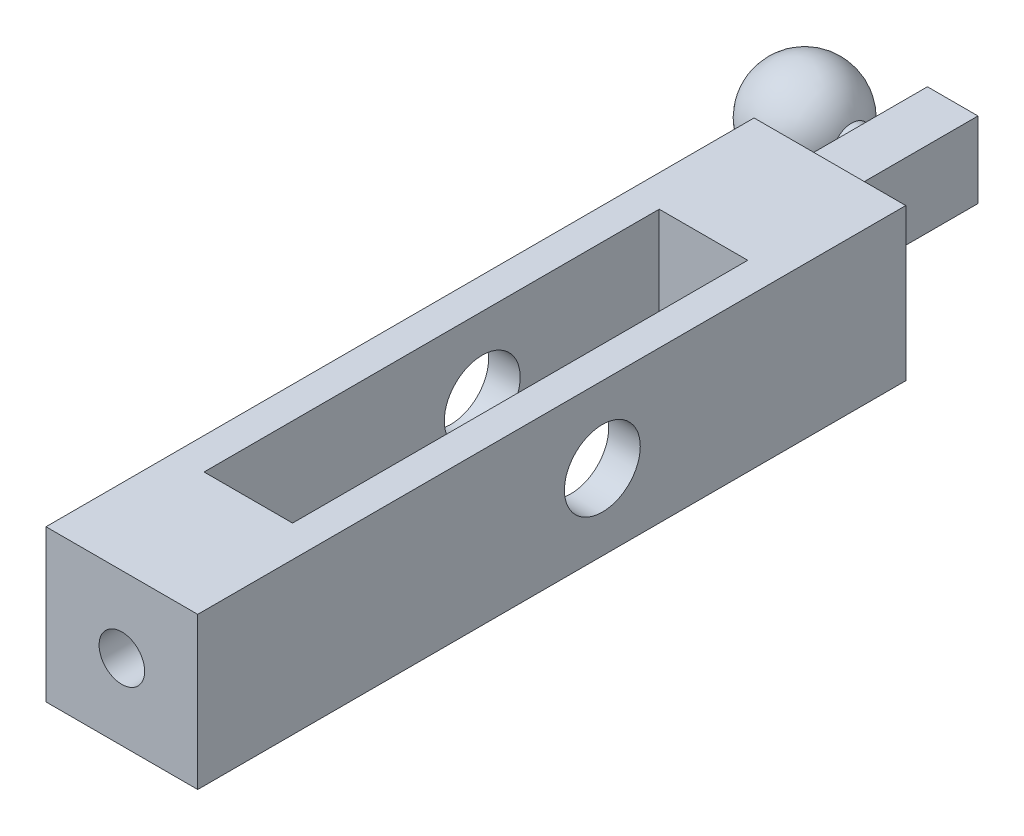
ISO-10303-21;
HEADER;
FILE_DESCRIPTION(('STEP AP214'),'2;1');
FILE_NAME('part.step','',(''),(''),'','','');
FILE_SCHEMA(('AUTOMOTIVE_DESIGN { 1 0 10303 214 1 1 1 1 }'));
ENDSEC;
DATA;
#1=APPLICATION_CONTEXT('core data for automotive mechanical design processes');
#2=APPLICATION_PROTOCOL_DEFINITION('international standard','automotive_design',2000,#1);
#3=PRODUCT_CONTEXT('',#1,'mechanical');
#4=PRODUCT('Part','Part','',(#3));
#5=PRODUCT_RELATED_PRODUCT_CATEGORY('part','',(#4));
#6=PRODUCT_DEFINITION_FORMATION('','',#4);
#7=PRODUCT_DEFINITION_CONTEXT('part definition',#1,'design');
#8=PRODUCT_DEFINITION('design','',#6,#7);
#9=PRODUCT_DEFINITION_SHAPE('','',#8);
#10=(LENGTH_UNIT() NAMED_UNIT(*) SI_UNIT(.MILLI.,.METRE.));
#11=(NAMED_UNIT(*) PLANE_ANGLE_UNIT() SI_UNIT($,.RADIAN.));
#12=(NAMED_UNIT(*) SI_UNIT($,.STERADIAN.) SOLID_ANGLE_UNIT());
#13=UNCERTAINTY_MEASURE_WITH_UNIT(LENGTH_MEASURE(1.E-05),#10,'distance_accuracy_value','');
#14=(GEOMETRIC_REPRESENTATION_CONTEXT(3) GLOBAL_UNCERTAINTY_ASSIGNED_CONTEXT((#13)) GLOBAL_UNIT_ASSIGNED_CONTEXT((#10,
#11,#12)) REPRESENTATION_CONTEXT('',''));
#15=CARTESIAN_POINT('',(0.,0.,0.));
#16=DIRECTION('',(0.,0.,1.));
#17=DIRECTION('',(1.,0.,0.));
#18=AXIS2_PLACEMENT_3D('',#15,#16,#17);
#19=CARTESIAN_POINT('',(3.,-3.,-28.));
#20=DIRECTION('',(0.,1.,0.));
#21=DIRECTION('',(-1.,0.,0.));
#22=AXIS2_PLACEMENT_3D('',#19,#20,#21);
#23=PLANE('',#22);
#24=DIRECTION('',(1.,0.,0.));
#25=VECTOR('',#24,1.);
#26=CARTESIAN_POINT('',(3.,-3.,0.));
#27=LINE('',#26,#25);
#28=CARTESIAN_POINT('',(-3.,-3.,0.));
#29=VERTEX_POINT('',#28);
#30=CARTESIAN_POINT('',(3.,-3.,0.));
#31=VERTEX_POINT('',#30);
#32=EDGE_CURVE('E222',#29,#31,#27,.T.);
#33=ORIENTED_EDGE('',*,*,#32,.F.);
#34=DIRECTION('',(0.,0.,1.));
#35=VECTOR('',#34,1.);
#36=CARTESIAN_POINT('',(-3.,-3.,-28.));
#37=LINE('',#36,#35);
#38=CARTESIAN_POINT('',(-3.,-3.,-28.));
#39=VERTEX_POINT('',#38);
#40=EDGE_CURVE('E50',#39,#29,#37,.T.);
#41=ORIENTED_EDGE('',*,*,#40,.F.);
#42=DIRECTION('',(1.,0.,0.));
#43=VECTOR('',#42,1.);
#44=CARTESIAN_POINT('',(3.,-3.,-28.));
#45=LINE('',#44,#43);
#46=CARTESIAN_POINT('',(3.,-3.,-28.));
#47=VERTEX_POINT('',#46);
#48=EDGE_CURVE('E211',#39,#47,#45,.T.);
#49=ORIENTED_EDGE('',*,*,#48,.T.);
#50=DIRECTION('',(0.,0.,1.));
#51=VECTOR('',#50,1.);
#52=CARTESIAN_POINT('',(3.,-3.,-28.));
#53=LINE('',#52,#51);
#54=EDGE_CURVE('E234',#47,#31,#53,.T.);
#55=ORIENTED_EDGE('',*,*,#54,.T.);
#56=EDGE_LOOP('',(#33,#41,#49,#55));
#57=FACE_BOUND('',#56,.T.);
#58=DIRECTION('',(1.,0.,0.));
#59=VECTOR('',#58,1.);
#60=CARTESIAN_POINT('',(3.,-3.,-5.));
#61=LINE('',#60,#59);
#62=CARTESIAN_POINT('',(-1.75,-3.,-5.));
#63=VERTEX_POINT('',#62);
#64=CARTESIAN_POINT('',(1.75,-3.,-5.));
#65=VERTEX_POINT('',#64);
#66=EDGE_CURVE('E172',#63,#65,#61,.T.);
#67=ORIENTED_EDGE('',*,*,#66,.T.);
#68=DIRECTION('',(0.,0.,-1.));
#69=VECTOR('',#68,1.);
#70=CARTESIAN_POINT('',(1.75,-3.,-28.));
#71=LINE('',#70,#69);
#72=CARTESIAN_POINT('',(1.75,-3.,-23.));
#73=VERTEX_POINT('',#72);
#74=EDGE_CURVE('E140',#65,#73,#71,.T.);
#75=ORIENTED_EDGE('',*,*,#74,.T.);
#76=DIRECTION('',(-1.,0.,0.));
#77=VECTOR('',#76,1.);
#78=CARTESIAN_POINT('',(3.,-3.,-23.));
#79=LINE('',#78,#77);
#80=CARTESIAN_POINT('',(-1.75,-3.,-23.));
#81=VERTEX_POINT('',#80);
#82=EDGE_CURVE('E168',#73,#81,#79,.T.);
#83=ORIENTED_EDGE('',*,*,#82,.T.);
#84=DIRECTION('',(0.,0.,1.));
#85=VECTOR('',#84,1.);
#86=CARTESIAN_POINT('',(-1.75,-3.,-28.));
#87=LINE('',#86,#85);
#88=EDGE_CURVE('E142',#81,#63,#87,.T.);
#89=ORIENTED_EDGE('',*,*,#88,.T.);
#90=EDGE_LOOP('',(#67,#75,#83,#89));
#91=FACE_BOUND('',#90,.T.);
#92=ADVANCED_FACE('F41',(#57,#91),#23,.F.);
#93=CARTESIAN_POINT('',(3.,3.,-28.));
#94=DIRECTION('',(0.,-1.,0.));
#95=DIRECTION('',(1.,0.,0.));
#96=AXIS2_PLACEMENT_3D('',#93,#94,#95);
#97=PLANE('',#96);
#98=DIRECTION('',(-1.,0.,0.));
#99=VECTOR('',#98,1.);
#100=CARTESIAN_POINT('',(3.,3.,0.));
#101=LINE('',#100,#99);
#102=CARTESIAN_POINT('',(3.,3.,0.));
#103=VERTEX_POINT('',#102);
#104=CARTESIAN_POINT('',(-3.,3.,0.));
#105=VERTEX_POINT('',#104);
#106=EDGE_CURVE('E212',#103,#105,#101,.T.);
#107=ORIENTED_EDGE('',*,*,#106,.F.);
#108=DIRECTION('',(0.,0.,1.));
#109=VECTOR('',#108,1.);
#110=CARTESIAN_POINT('',(3.,3.,-28.));
#111=LINE('',#110,#109);
#112=CARTESIAN_POINT('',(3.,3.,-28.));
#113=VERTEX_POINT('',#112);
#114=EDGE_CURVE('E231',#113,#103,#111,.T.);
#115=ORIENTED_EDGE('',*,*,#114,.F.);
#116=DIRECTION('',(-1.,0.,0.));
#117=VECTOR('',#116,1.);
#118=CARTESIAN_POINT('',(3.,3.,-28.));
#119=LINE('',#118,#117);
#120=CARTESIAN_POINT('',(-3.,3.,-28.));
#121=VERTEX_POINT('',#120);
#122=EDGE_CURVE('E217',#113,#121,#119,.T.);
#123=ORIENTED_EDGE('',*,*,#122,.T.);
#124=DIRECTION('',(0.,0.,1.));
#125=VECTOR('',#124,1.);
#126=CARTESIAN_POINT('',(-3.,3.,-28.));
#127=LINE('',#126,#125);
#128=EDGE_CURVE('E220',#121,#105,#127,.T.);
#129=ORIENTED_EDGE('',*,*,#128,.T.);
#130=EDGE_LOOP('',(#107,#115,#123,#129));
#131=FACE_BOUND('',#130,.T.);
#132=DIRECTION('',(1.,0.,0.));
#133=VECTOR('',#132,1.);
#134=CARTESIAN_POINT('',(-1.75,3.,-5.));
#135=LINE('',#134,#133);
#136=CARTESIAN_POINT('',(-1.75,3.,-5.));
#137=VERTEX_POINT('',#136);
#138=CARTESIAN_POINT('',(1.75,3.,-5.));
#139=VERTEX_POINT('',#138);
#140=EDGE_CURVE('E149',#137,#139,#135,.T.);
#141=ORIENTED_EDGE('',*,*,#140,.F.);
#142=DIRECTION('',(0.,0.,1.));
#143=VECTOR('',#142,1.);
#144=CARTESIAN_POINT('',(-1.75,3.,-5.));
#145=LINE('',#144,#143);
#146=CARTESIAN_POINT('',(-1.75,3.,-23.));
#147=VERTEX_POINT('',#146);
#148=EDGE_CURVE('E161',#147,#137,#145,.T.);
#149=ORIENTED_EDGE('',*,*,#148,.F.);
#150=DIRECTION('',(-1.,0.,0.));
#151=VECTOR('',#150,1.);
#152=CARTESIAN_POINT('',(-1.75,3.,-23.));
#153=LINE('',#152,#151);
#154=CARTESIAN_POINT('',(1.75,3.,-23.));
#155=VERTEX_POINT('',#154);
#156=EDGE_CURVE('E150',#155,#147,#153,.T.);
#157=ORIENTED_EDGE('',*,*,#156,.F.);
#158=DIRECTION('',(0.,0.,-1.));
#159=VECTOR('',#158,1.);
#160=CARTESIAN_POINT('',(1.75,3.,-5.));
#161=LINE('',#160,#159);
#162=EDGE_CURVE('E137',#139,#155,#161,.T.);
#163=ORIENTED_EDGE('',*,*,#162,.F.);
#164=EDGE_LOOP('',(#141,#149,#157,#163));
#165=FACE_BOUND('',#164,.T.);
#166=ADVANCED_FACE('F147',(#131,#165),#97,.F.);
#167=CARTESIAN_POINT('',(0.,0.,-28.));
#168=DIRECTION('',(0.,0.,-1.));
#169=DIRECTION('',(1.,0.,0.));
#170=AXIS2_PLACEMENT_3D('',#167,#168,#169);
#171=PLANE('',#170);
#172=DIRECTION('',(0.,-1.,0.));
#173=VECTOR('',#172,1.);
#174=CARTESIAN_POINT('',(-3.,-3.,-28.));
#175=LINE('',#174,#173);
#176=EDGE_CURVE('E209',#121,#39,#175,.T.);
#177=ORIENTED_EDGE('',*,*,#176,.F.);
#178=ORIENTED_EDGE('',*,*,#122,.F.);
#179=DIRECTION('',(0.,1.,0.));
#180=VECTOR('',#179,1.);
#181=CARTESIAN_POINT('',(3.,-3.,-28.));
#182=LINE('',#181,#180);
#183=EDGE_CURVE('E215',#47,#113,#182,.T.);
#184=ORIENTED_EDGE('',*,*,#183,.F.);
#185=ORIENTED_EDGE('',*,*,#48,.F.);
#186=EDGE_LOOP('',(#177,#178,#184,#185));
#187=FACE_BOUND('',#186,.T.);
#188=DIRECTION('',(-1.,0.,0.));
#189=VECTOR('',#188,1.);
#190=CARTESIAN_POINT('',(-2.14479354998716,1.49545918544692,-28.));
#191=LINE('',#190,#189);
#192=CARTESIAN_POINT('',(-0.144793549987163,1.49545918544692,-28.));
#193=VERTEX_POINT('',#192);
#194=CARTESIAN_POINT('',(-2.14479354998716,1.49545918544692,-28.));
#195=VERTEX_POINT('',#194);
#196=EDGE_CURVE('E193',#193,#195,#191,.T.);
#197=ORIENTED_EDGE('',*,*,#196,.T.);
#198=DIRECTION('',(0.,-1.,0.));
#199=VECTOR('',#198,1.);
#200=CARTESIAN_POINT('',(-2.14479354998716,1.49545918544692,-28.));
#201=LINE('',#200,#199);
#202=CARTESIAN_POINT('',(-2.14479354998716,-1.50454081455308,-28.));
#203=VERTEX_POINT('',#202);
#204=EDGE_CURVE('E196',#195,#203,#201,.T.);
#205=ORIENTED_EDGE('',*,*,#204,.T.);
#206=DIRECTION('',(1.,0.,0.));
#207=VECTOR('',#206,1.);
#208=CARTESIAN_POINT('',(-2.14479354998716,-1.50454081455308,-28.));
#209=LINE('',#208,#207);
#210=CARTESIAN_POINT('',(-0.144793549987163,-1.50454081455308,-28.));
#211=VERTEX_POINT('',#210);
#212=EDGE_CURVE('E182',#203,#211,#209,.T.);
#213=ORIENTED_EDGE('',*,*,#212,.T.);
#214=DIRECTION('',(0.,1.,0.));
#215=VECTOR('',#214,1.);
#216=CARTESIAN_POINT('',(-0.144793549987163,1.49545918544692,-28.));
#217=LINE('',#216,#215);
#218=EDGE_CURVE('E177',#211,#193,#217,.T.);
#219=ORIENTED_EDGE('',*,*,#218,.T.);
#220=EDGE_LOOP('',(#197,#205,#213,#219));
#221=FACE_BOUND('',#220,.T.);
#222=ADVANCED_FACE('F274',(#187,#221),#171,.T.);
#223=CARTESIAN_POINT('',(-3.,-3.,-28.));
#224=DIRECTION('',(1.,0.,0.));
#225=DIRECTION('',(0.,0.,1.));
#226=AXIS2_PLACEMENT_3D('',#223,#224,#225);
#227=PLANE('',#226);
#228=CARTESIAN_POINT('',(-3.,0.,-16.));
#229=DIRECTION('',(1.,0.,0.));
#230=DIRECTION('',(0.,0.,-1.));
#231=AXIS2_PLACEMENT_3D('',#228,#229,#230);
#232=CIRCLE('',#231,1.5);
#233=CARTESIAN_POINT('',(-3.,0.,-17.5));
#234=VERTEX_POINT('',#233);
#235=EDGE_CURVE('E240',#234,#234,#232,.T.);
#236=ORIENTED_EDGE('',*,*,#235,.T.);
#237=EDGE_LOOP('',(#236));
#238=FACE_BOUND('',#237,.T.);
#239=DIRECTION('',(0.,-1.,0.));
#240=VECTOR('',#239,1.);
#241=CARTESIAN_POINT('',(-3.,-3.,0.));
#242=LINE('',#241,#240);
#243=EDGE_CURVE('E208',#105,#29,#242,.T.);
#244=ORIENTED_EDGE('',*,*,#243,.F.);
#245=ORIENTED_EDGE('',*,*,#128,.F.);
#246=ORIENTED_EDGE('',*,*,#176,.T.);
#247=ORIENTED_EDGE('',*,*,#40,.T.);
#248=EDGE_LOOP('',(#244,#245,#246,#247));
#249=FACE_BOUND('',#248,.T.);
#250=ADVANCED_FACE('F43',(#238,#249),#227,.F.);
#251=CARTESIAN_POINT('',(3.,-3.,-28.));
#252=DIRECTION('',(-1.,0.,0.));
#253=DIRECTION('',(0.,0.,-1.));
#254=AXIS2_PLACEMENT_3D('',#251,#252,#253);
#255=PLANE('',#254);
#256=CARTESIAN_POINT('',(3.,0.,-16.));
#257=DIRECTION('',(1.,0.,0.));
#258=DIRECTION('',(0.,0.,-1.));
#259=AXIS2_PLACEMENT_3D('',#256,#257,#258);
#260=CIRCLE('',#259,1.5);
#261=CARTESIAN_POINT('',(3.,0.,-17.5));
#262=VERTEX_POINT('',#261);
#263=EDGE_CURVE('E153',#262,#262,#260,.T.);
#264=ORIENTED_EDGE('',*,*,#263,.F.);
#265=EDGE_LOOP('',(#264));
#266=FACE_BOUND('',#265,.T.);
#267=DIRECTION('',(0.,1.,0.));
#268=VECTOR('',#267,1.);
#269=CARTESIAN_POINT('',(3.,-3.,0.));
#270=LINE('',#269,#268);
#271=EDGE_CURVE('E225',#31,#103,#270,.T.);
#272=ORIENTED_EDGE('',*,*,#271,.F.);
#273=ORIENTED_EDGE('',*,*,#54,.F.);
#274=ORIENTED_EDGE('',*,*,#183,.T.);
#275=ORIENTED_EDGE('',*,*,#114,.T.);
#276=EDGE_LOOP('',(#272,#273,#274,#275));
#277=FACE_BOUND('',#276,.T.);
#278=ADVANCED_FACE('F280',(#266,#277),#255,.F.);
#279=CARTESIAN_POINT('',(0.,0.,0.));
#280=DIRECTION('',(0.,0.,-1.));
#281=DIRECTION('',(1.,0.,0.));
#282=AXIS2_PLACEMENT_3D('',#279,#280,#281);
#283=PLANE('',#282);
#284=CARTESIAN_POINT('',(0.,0.,0.));
#285=DIRECTION('',(0.,0.,-1.));
#286=DIRECTION('',(-1.,0.,0.));
#287=AXIS2_PLACEMENT_3D('',#284,#285,#286);
#288=CIRCLE('',#287,0.9);
#289=CARTESIAN_POINT('',(-0.9,0.,0.));
#290=VERTEX_POINT('',#289);
#291=EDGE_CURVE('E249',#290,#290,#288,.T.);
#292=ORIENTED_EDGE('',*,*,#291,.T.);
#293=EDGE_LOOP('',(#292));
#294=FACE_BOUND('',#293,.T.);
#295=ORIENTED_EDGE('',*,*,#243,.T.);
#296=ORIENTED_EDGE('',*,*,#32,.T.);
#297=ORIENTED_EDGE('',*,*,#271,.T.);
#298=ORIENTED_EDGE('',*,*,#106,.T.);
#299=EDGE_LOOP('',(#295,#296,#297,#298));
#300=FACE_BOUND('',#299,.T.);
#301=ADVANCED_FACE('F254',(#294,#300),#283,.F.);
#302=CARTESIAN_POINT('',(-0.144793549987163,1.49545918544692,-34.));
#303=DIRECTION('',(-1.,0.,0.));
#304=DIRECTION('',(0.,-1.,0.));
#305=AXIS2_PLACEMENT_3D('',#302,#303,#304);
#306=PLANE('',#305);
#307=ORIENTED_EDGE('',*,*,#218,.F.);
#308=DIRECTION('',(0.,0.,1.));
#309=VECTOR('',#308,1.);
#310=CARTESIAN_POINT('',(-0.144793549987163,-1.50454081455308,-34.));
#311=LINE('',#310,#309);
#312=CARTESIAN_POINT('',(-0.144793549987163,-1.50454081455308,-34.));
#313=VERTEX_POINT('',#312);
#314=EDGE_CURVE('E190',#313,#211,#311,.T.);
#315=ORIENTED_EDGE('',*,*,#314,.F.);
#316=DIRECTION('',(0.,1.,0.));
#317=VECTOR('',#316,1.);
#318=CARTESIAN_POINT('',(-0.144793549987163,1.49545918544692,-34.));
#319=LINE('',#318,#317);
#320=CARTESIAN_POINT('',(-0.144793549987163,1.49545918544692,-34.));
#321=VERTEX_POINT('',#320);
#322=EDGE_CURVE('E178',#313,#321,#319,.T.);
#323=ORIENTED_EDGE('',*,*,#322,.T.);
#324=DIRECTION('',(0.,0.,1.));
#325=VECTOR('',#324,1.);
#326=CARTESIAN_POINT('',(-0.144793549987163,1.49545918544692,-34.));
#327=LINE('',#326,#325);
#328=EDGE_CURVE('E206',#321,#193,#327,.T.);
#329=ORIENTED_EDGE('',*,*,#328,.T.);
#330=EDGE_LOOP('',(#307,#315,#323,#329));
#331=FACE_BOUND('',#330,.T.);
#332=ADVANCED_FACE('F286',(#331),#306,.F.);
#333=CARTESIAN_POINT('',(-2.14479354998716,1.49545918544692,-34.));
#334=DIRECTION('',(0.,-1.,0.));
#335=DIRECTION('',(1.,0.,0.));
#336=AXIS2_PLACEMENT_3D('',#333,#334,#335);
#337=PLANE('',#336);
#338=ORIENTED_EDGE('',*,*,#196,.F.);
#339=ORIENTED_EDGE('',*,*,#328,.F.);
#340=DIRECTION('',(-1.,0.,0.));
#341=VECTOR('',#340,1.);
#342=CARTESIAN_POINT('',(-2.14479354998716,1.49545918544692,-34.));
#343=LINE('',#342,#341);
#344=CARTESIAN_POINT('',(-2.14479354998716,1.49545918544692,-34.));
#345=VERTEX_POINT('',#344);
#346=EDGE_CURVE('E181',#321,#345,#343,.T.);
#347=ORIENTED_EDGE('',*,*,#346,.T.);
#348=DIRECTION('',(0.,0.,1.));
#349=VECTOR('',#348,1.);
#350=CARTESIAN_POINT('',(-2.14479354998716,1.49545918544692,-34.));
#351=LINE('',#350,#349);
#352=EDGE_CURVE('E204',#345,#195,#351,.T.);
#353=ORIENTED_EDGE('',*,*,#352,.T.);
#354=EDGE_LOOP('',(#338,#339,#347,#353));
#355=FACE_BOUND('',#354,.T.);
#356=ADVANCED_FACE('F292',(#355),#337,.F.);
#357=CARTESIAN_POINT('',(-2.14479354998716,1.49545918544692,-34.));
#358=DIRECTION('',(1.,0.,0.));
#359=DIRECTION('',(0.,1.,0.));
#360=AXIS2_PLACEMENT_3D('',#357,#358,#359);
#361=PLANE('',#360);
#362=CARTESIAN_POINT('',(-2.14479354998716,0.,-32.));
#363=DIRECTION('',(-1.,0.,0.));
#364=DIRECTION('',(0.,1.,0.));
#365=AXIS2_PLACEMENT_3D('',#362,#363,#364);
#366=CIRCLE('',#365,0.749999999999999);
#367=CARTESIAN_POINT('',(-2.14479354998716,0.749999999999998,-32.));
#368=VERTEX_POINT('',#367);
#369=EDGE_CURVE('E11',#368,#368,#366,.F.);
#370=ORIENTED_EDGE('',*,*,#369,.T.);
#371=EDGE_LOOP('',(#370));
#372=FACE_BOUND('',#371,.T.);
#373=ORIENTED_EDGE('',*,*,#204,.F.);
#374=ORIENTED_EDGE('',*,*,#352,.F.);
#375=DIRECTION('',(0.,-1.,0.));
#376=VECTOR('',#375,1.);
#377=CARTESIAN_POINT('',(-2.14479354998716,1.49545918544692,-34.));
#378=LINE('',#377,#376);
#379=CARTESIAN_POINT('',(-2.14479354998716,-1.50454081455308,-34.));
#380=VERTEX_POINT('',#379);
#381=EDGE_CURVE('E185',#345,#380,#378,.T.);
#382=ORIENTED_EDGE('',*,*,#381,.T.);
#383=DIRECTION('',(0.,0.,1.));
#384=VECTOR('',#383,1.);
#385=CARTESIAN_POINT('',(-2.14479354998716,-1.50454081455308,-34.));
#386=LINE('',#385,#384);
#387=EDGE_CURVE('E202',#380,#203,#386,.T.);
#388=ORIENTED_EDGE('',*,*,#387,.T.);
#389=EDGE_LOOP('',(#373,#374,#382,#388));
#390=FACE_BOUND('',#389,.T.);
#391=ADVANCED_FACE('F296',(#372,#390),#361,.F.);
#392=CARTESIAN_POINT('',(-2.14479354998716,-1.50454081455308,-34.));
#393=DIRECTION('',(0.,1.,0.));
#394=DIRECTION('',(-1.,0.,0.));
#395=AXIS2_PLACEMENT_3D('',#392,#393,#394);
#396=PLANE('',#395);
#397=ORIENTED_EDGE('',*,*,#212,.F.);
#398=ORIENTED_EDGE('',*,*,#387,.F.);
#399=DIRECTION('',(1.,0.,0.));
#400=VECTOR('',#399,1.);
#401=CARTESIAN_POINT('',(-2.14479354998716,-1.50454081455308,-34.));
#402=LINE('',#401,#400);
#403=EDGE_CURVE('E188',#380,#313,#402,.T.);
#404=ORIENTED_EDGE('',*,*,#403,.T.);
#405=ORIENTED_EDGE('',*,*,#314,.T.);
#406=EDGE_LOOP('',(#397,#398,#404,#405));
#407=FACE_BOUND('',#406,.T.);
#408=ADVANCED_FACE('F300',(#407),#396,.F.);
#409=CARTESIAN_POINT('',(0.,0.,-34.));
#410=DIRECTION('',(0.,0.,-1.));
#411=DIRECTION('',(1.,0.,0.));
#412=AXIS2_PLACEMENT_3D('',#409,#410,#411);
#413=PLANE('',#412);
#414=ORIENTED_EDGE('',*,*,#322,.F.);
#415=ORIENTED_EDGE('',*,*,#403,.F.);
#416=ORIENTED_EDGE('',*,*,#381,.F.);
#417=ORIENTED_EDGE('',*,*,#346,.F.);
#418=EDGE_LOOP('',(#414,#415,#416,#417));
#419=FACE_BOUND('',#418,.T.);
#420=ADVANCED_FACE('F304',(#419),#413,.T.);
#421=CARTESIAN_POINT('',(-3.14479354998716,0.,-32.));
#422=DIRECTION('',(1.,0.,0.));
#423=DIRECTION('',(0.,1.,0.));
#424=AXIS2_PLACEMENT_3D('',#421,#422,#423);
#425=CYLINDRICAL_SURFACE('',#424,0.749999999999999);
#426=CARTESIAN_POINT('',(-3.14479354998716,0.,-32.));
#427=DIRECTION('',(1.,0.,0.));
#428=DIRECTION('',(0.,-1.,0.));
#429=AXIS2_PLACEMENT_3D('',#426,#427,#428);
#430=CIRCLE('',#429,0.749999999999999);
#431=CARTESIAN_POINT('',(-3.14479354998716,-0.749999999999999,-32.));
#432=VERTEX_POINT('',#431);
#433=EDGE_CURVE('E174',#432,#432,#430,.T.);
#434=ORIENTED_EDGE('',*,*,#433,.T.);
#435=EDGE_LOOP('',(#434));
#436=FACE_BOUND('',#435,.T.);
#437=ORIENTED_EDGE('',*,*,#369,.F.);
#438=EDGE_LOOP('',(#437));
#439=FACE_BOUND('',#438,.T.);
#440=ADVANCED_FACE('F308',(#436,#439),#425,.T.);
#441=CARTESIAN_POINT('',(-4.99884317176108,0.,-32.));
#442=DIRECTION('',(1.,0.,0.));
#443=DIRECTION('',(0.,0.,1.));
#444=AXIS2_PLACEMENT_3D('',#441,#442,#443);
#445=SPHERICAL_SURFACE('',#444,2.);
#446=ORIENTED_EDGE('',*,*,#433,.F.);
#447=EDGE_LOOP('',(#446));
#448=FACE_BOUND('',#447,.T.);
#449=ADVANCED_FACE('F312',(#448),#445,.T.);
#450=CARTESIAN_POINT('',(-1.75,-5.,-5.));
#451=DIRECTION('',(0.,0.,-1.));
#452=DIRECTION('',(1.,0.,0.));
#453=AXIS2_PLACEMENT_3D('',#450,#451,#452);
#454=PLANE('',#453);
#455=CARTESIAN_POINT('',(0.,0.,-5.));
#456=DIRECTION('',(0.,0.,1.));
#457=DIRECTION('',(1.,0.,0.));
#458=AXIS2_PLACEMENT_3D('',#455,#456,#457);
#459=CIRCLE('',#458,0.9);
#460=CARTESIAN_POINT('',(0.9,0.,-5.));
#461=VERTEX_POINT('',#460);
#462=EDGE_CURVE('E45',#461,#461,#459,.T.);
#463=ORIENTED_EDGE('',*,*,#462,.T.);
#464=EDGE_LOOP('',(#463));
#465=FACE_BOUND('',#464,.T.);
#466=ORIENTED_EDGE('',*,*,#66,.F.);
#467=DIRECTION('',(0.,1.,0.));
#468=VECTOR('',#467,1.);
#469=CARTESIAN_POINT('',(-1.75,-5.,-5.));
#470=LINE('',#469,#468);
#471=EDGE_CURVE('E66',#63,#137,#470,.T.);
#472=ORIENTED_EDGE('',*,*,#471,.T.);
#473=ORIENTED_EDGE('',*,*,#140,.T.);
#474=DIRECTION('',(0.,1.,0.));
#475=VECTOR('',#474,1.);
#476=CARTESIAN_POINT('',(1.75,-5.,-5.));
#477=LINE('',#476,#475);
#478=EDGE_CURVE('E134',#65,#139,#477,.T.);
#479=ORIENTED_EDGE('',*,*,#478,.F.);
#480=EDGE_LOOP('',(#466,#472,#473,#479));
#481=FACE_BOUND('',#480,.T.);
#482=ADVANCED_FACE('F152',(#465,#481),#454,.T.);
#483=CARTESIAN_POINT('',(1.75,-5.,-5.));
#484=DIRECTION('',(-1.,0.,0.));
#485=DIRECTION('',(0.,-1.,0.));
#486=AXIS2_PLACEMENT_3D('',#483,#484,#485);
#487=PLANE('',#486);
#488=CARTESIAN_POINT('',(1.75,0.,-16.));
#489=DIRECTION('',(1.,0.,0.));
#490=DIRECTION('',(0.,-1.,0.));
#491=AXIS2_PLACEMENT_3D('',#488,#489,#490);
#492=CIRCLE('',#491,1.5);
#493=CARTESIAN_POINT('',(1.75,-1.5,-16.));
#494=VERTEX_POINT('',#493);
#495=EDGE_CURVE('E156',#494,#494,#492,.T.);
#496=ORIENTED_EDGE('',*,*,#495,.T.);
#497=EDGE_LOOP('',(#496));
#498=FACE_BOUND('',#497,.T.);
#499=ORIENTED_EDGE('',*,*,#74,.F.);
#500=ORIENTED_EDGE('',*,*,#478,.T.);
#501=ORIENTED_EDGE('',*,*,#162,.T.);
#502=DIRECTION('',(0.,1.,0.));
#503=VECTOR('',#502,1.);
#504=CARTESIAN_POINT('',(1.75,-5.,-23.));
#505=LINE('',#504,#503);
#506=EDGE_CURVE('E143',#73,#155,#505,.T.);
#507=ORIENTED_EDGE('',*,*,#506,.F.);
#508=EDGE_LOOP('',(#499,#500,#501,#507));
#509=FACE_BOUND('',#508,.T.);
#510=ADVANCED_FACE('F136',(#498,#509),#487,.T.);
#511=CARTESIAN_POINT('',(-1.75000000000001,-5.,-23.));
#512=DIRECTION('',(0.,0.,1.));
#513=DIRECTION('',(-1.,0.,0.));
#514=AXIS2_PLACEMENT_3D('',#511,#512,#513);
#515=PLANE('',#514);
#516=ORIENTED_EDGE('',*,*,#82,.F.);
#517=ORIENTED_EDGE('',*,*,#506,.T.);
#518=ORIENTED_EDGE('',*,*,#156,.T.);
#519=DIRECTION('',(0.,1.,0.));
#520=VECTOR('',#519,1.);
#521=CARTESIAN_POINT('',(-1.75000000000001,-5.,-23.));
#522=LINE('',#521,#520);
#523=EDGE_CURVE('E58',#81,#147,#522,.T.);
#524=ORIENTED_EDGE('',*,*,#523,.F.);
#525=EDGE_LOOP('',(#516,#517,#518,#524));
#526=FACE_BOUND('',#525,.T.);
#527=ADVANCED_FACE('F322',(#526),#515,.T.);
#528=CARTESIAN_POINT('',(-1.75,-5.,-5.));
#529=DIRECTION('',(1.,0.,0.));
#530=DIRECTION('',(0.,1.,0.));
#531=AXIS2_PLACEMENT_3D('',#528,#529,#530);
#532=PLANE('',#531);
#533=CARTESIAN_POINT('',(-1.75,0.,-16.));
#534=DIRECTION('',(-1.,0.,0.));
#535=DIRECTION('',(0.,1.,0.));
#536=AXIS2_PLACEMENT_3D('',#533,#534,#535);
#537=CIRCLE('',#536,1.5);
#538=CARTESIAN_POINT('',(-1.75,1.5,-16.));
#539=VERTEX_POINT('',#538);
#540=EDGE_CURVE('E238',#539,#539,#537,.T.);
#541=ORIENTED_EDGE('',*,*,#540,.T.);
#542=EDGE_LOOP('',(#541));
#543=FACE_BOUND('',#542,.T.);
#544=ORIENTED_EDGE('',*,*,#88,.F.);
#545=ORIENTED_EDGE('',*,*,#523,.T.);
#546=ORIENTED_EDGE('',*,*,#148,.T.);
#547=ORIENTED_EDGE('',*,*,#471,.F.);
#548=EDGE_LOOP('',(#544,#545,#546,#547));
#549=FACE_BOUND('',#548,.T.);
#550=ADVANCED_FACE('F326',(#543,#549),#532,.T.);
#551=CARTESIAN_POINT('',(5.,0.,-16.));
#552=DIRECTION('',(-1.,0.,0.));
#553=DIRECTION('',(0.,0.,-1.));
#554=AXIS2_PLACEMENT_3D('',#551,#552,#553);
#555=CYLINDRICAL_SURFACE('',#554,1.5);
#556=ORIENTED_EDGE('',*,*,#540,.F.);
#557=EDGE_LOOP('',(#556));
#558=FACE_BOUND('',#557,.T.);
#559=ORIENTED_EDGE('',*,*,#235,.F.);
#560=EDGE_LOOP('',(#559));
#561=FACE_BOUND('',#560,.T.);
#562=ADVANCED_FACE('F265',(#558,#561),#555,.F.);
#563=ORIENTED_EDGE('',*,*,#495,.F.);
#564=EDGE_LOOP('',(#563));
#565=FACE_BOUND('',#564,.T.);
#566=ORIENTED_EDGE('',*,*,#263,.T.);
#567=EDGE_LOOP('',(#566));
#568=FACE_BOUND('',#567,.T.);
#569=ADVANCED_FACE('F259',(#565,#568),#555,.F.);
#570=CARTESIAN_POINT('',(0.,0.,-8.));
#571=DIRECTION('',(0.,0.,1.));
#572=DIRECTION('',(-1.,0.,0.));
#573=AXIS2_PLACEMENT_3D('',#570,#571,#572);
#574=CYLINDRICAL_SURFACE('',#573,0.9);
#575=ORIENTED_EDGE('',*,*,#462,.F.);
#576=EDGE_LOOP('',(#575));
#577=FACE_BOUND('',#576,.T.);
#578=ORIENTED_EDGE('',*,*,#291,.F.);
#579=EDGE_LOOP('',(#578));
#580=FACE_BOUND('',#579,.T.);
#581=ADVANCED_FACE('F257',(#577,#580),#574,.F.);
#582=CLOSED_SHELL('',(#92,#166,#222,#250,#278,#301,#332,#356,#391,#408,#420,#440,#449,#482,#510,
#527,#550,#562,#569,#581));
#583=MANIFOLD_SOLID_BREP('B2',#582);
#584=ADVANCED_BREP_SHAPE_REPRESENTATION('',(#18,#583),#14);
#585=SHAPE_DEFINITION_REPRESENTATION(#9,#584);
ENDSEC;
END-ISO-10303-21;
